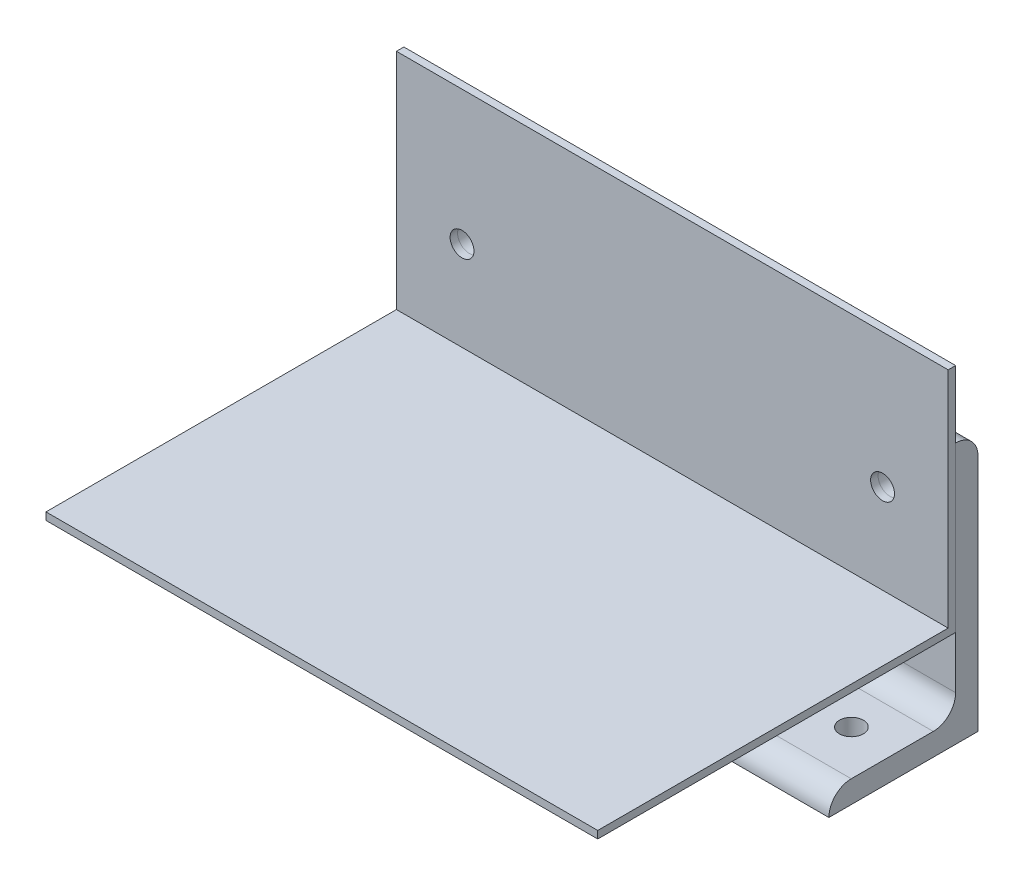
ISO-10303-21;
HEADER;
FILE_DESCRIPTION(('STEP AP214'),'2;1');
FILE_NAME('part.step','',(''),(''),'','','');
FILE_SCHEMA(('AUTOMOTIVE_DESIGN { 1 0 10303 214 1 1 1 1 }'));
ENDSEC;
DATA;
#1=APPLICATION_CONTEXT('core data for automotive mechanical design processes');
#2=APPLICATION_PROTOCOL_DEFINITION('international standard','automotive_design',2000,#1);
#3=PRODUCT_CONTEXT('',#1,'mechanical');
#4=PRODUCT('Part','Part','',(#3));
#5=PRODUCT_RELATED_PRODUCT_CATEGORY('part','',(#4));
#6=PRODUCT_DEFINITION_FORMATION('','',#4);
#7=PRODUCT_DEFINITION_CONTEXT('part definition',#1,'design');
#8=PRODUCT_DEFINITION('design','',#6,#7);
#9=PRODUCT_DEFINITION_SHAPE('','',#8);
#10=(LENGTH_UNIT() NAMED_UNIT(*) SI_UNIT(.MILLI.,.METRE.));
#11=(NAMED_UNIT(*) PLANE_ANGLE_UNIT() SI_UNIT($,.RADIAN.));
#12=(NAMED_UNIT(*) SI_UNIT($,.STERADIAN.) SOLID_ANGLE_UNIT());
#13=UNCERTAINTY_MEASURE_WITH_UNIT(LENGTH_MEASURE(1.E-05),#10,'distance_accuracy_value','');
#14=(GEOMETRIC_REPRESENTATION_CONTEXT(3) GLOBAL_UNCERTAINTY_ASSIGNED_CONTEXT((#13)) GLOBAL_UNIT_ASSIGNED_CONTEXT((#10,
#11,#12)) REPRESENTATION_CONTEXT('',''));
#15=CARTESIAN_POINT('',(0.,0.,0.));
#16=DIRECTION('',(0.,0.,1.));
#17=DIRECTION('',(1.,0.,0.));
#18=AXIS2_PLACEMENT_3D('',#15,#16,#17);
#19=CARTESIAN_POINT('',(74.,22.,-3.));
#20=DIRECTION('',(-1.,0.,0.));
#21=DIRECTION('',(0.,0.,1.));
#22=AXIS2_PLACEMENT_3D('',#19,#20,#21);
#23=PLANE('',#22);
#24=DIRECTION('',(0.,-1.,0.));
#25=VECTOR('',#24,1.);
#26=CARTESIAN_POINT('',(74.,22.,0.));
#27=LINE('',#26,#25);
#28=CARTESIAN_POINT('',(74.,22.,0.));
#29=VERTEX_POINT('',#28);
#30=CARTESIAN_POINT('',(74.,-7.,0.));
#31=VERTEX_POINT('',#30);
#32=EDGE_CURVE('E149',#29,#31,#27,.T.);
#33=ORIENTED_EDGE('',*,*,#32,.T.);
#34=CARTESIAN_POINT('',(74.,-7.,3.));
#35=DIRECTION('',(-1.,0.,0.));
#36=DIRECTION('',(0.,0.,1.));
#37=AXIS2_PLACEMENT_3D('',#34,#35,#36);
#38=CIRCLE('',#37,3.);
#39=CARTESIAN_POINT('',(74.,-10.,3.));
#40=VERTEX_POINT('',#39);
#41=EDGE_CURVE('E12',#31,#40,#38,.T.);
#42=ORIENTED_EDGE('',*,*,#41,.T.);
#43=DIRECTION('',(0.,0.,1.));
#44=VECTOR('',#43,1.);
#45=CARTESIAN_POINT('',(74.,-10.,-3.));
#46=LINE('',#45,#44);
#47=CARTESIAN_POINT('',(74.,-10.,14.));
#48=VERTEX_POINT('',#47);
#49=EDGE_CURVE('E139',#40,#48,#46,.T.);
#50=ORIENTED_EDGE('',*,*,#49,.T.);
#51=CARTESIAN_POINT('',(74.,-13.,14.));
#52=DIRECTION('',(-1.,0.,0.));
#53=DIRECTION('',(0.,0.,1.));
#54=AXIS2_PLACEMENT_3D('',#51,#52,#53);
#55=CIRCLE('',#54,3.);
#56=CARTESIAN_POINT('',(74.,-13.,17.));
#57=VERTEX_POINT('',#56);
#58=EDGE_CURVE('E168',#48,#57,#55,.F.);
#59=ORIENTED_EDGE('',*,*,#58,.T.);
#60=DIRECTION('',(0.,0.,1.));
#61=VECTOR('',#60,1.);
#62=CARTESIAN_POINT('',(74.,-13.,-3.));
#63=LINE('',#62,#61);
#64=CARTESIAN_POINT('',(74.,-13.,-3.));
#65=VERTEX_POINT('',#64);
#66=EDGE_CURVE('E132',#65,#57,#63,.T.);
#67=ORIENTED_EDGE('',*,*,#66,.F.);
#68=DIRECTION('',(0.,-1.,0.));
#69=VECTOR('',#68,1.);
#70=CARTESIAN_POINT('',(74.,22.,-3.));
#71=LINE('',#70,#69);
#72=CARTESIAN_POINT('',(74.,19.,-3.));
#73=VERTEX_POINT('',#72);
#74=EDGE_CURVE('E123',#73,#65,#71,.T.);
#75=ORIENTED_EDGE('',*,*,#74,.F.);
#76=CARTESIAN_POINT('',(74.,19.,0.));
#77=DIRECTION('',(-1.,0.,0.));
#78=DIRECTION('',(0.,0.,1.));
#79=AXIS2_PLACEMENT_3D('',#76,#77,#78);
#80=CIRCLE('',#79,3.);
#81=EDGE_CURVE('E160',#73,#29,#80,.F.);
#82=ORIENTED_EDGE('',*,*,#81,.T.);
#83=EDGE_LOOP('',(#33,#42,#50,#59,#67,#75,#82));
#84=FACE_BOUND('',#83,.T.);
#85=ADVANCED_FACE('F55',(#84),#23,.F.);
#86=CARTESIAN_POINT('',(0.,22.,-3.));
#87=DIRECTION('',(1.,0.,0.));
#88=DIRECTION('',(0.,0.,-1.));
#89=AXIS2_PLACEMENT_3D('',#86,#87,#88);
#90=PLANE('',#89);
#91=DIRECTION('',(0.,0.,-1.));
#92=VECTOR('',#91,1.);
#93=CARTESIAN_POINT('',(0.,-13.,-3.));
#94=LINE('',#93,#92);
#95=CARTESIAN_POINT('',(0.,-13.,17.));
#96=VERTEX_POINT('',#95);
#97=CARTESIAN_POINT('',(0.,-13.,-3.));
#98=VERTEX_POINT('',#97);
#99=EDGE_CURVE('E116',#96,#98,#94,.T.);
#100=ORIENTED_EDGE('',*,*,#99,.F.);
#101=CARTESIAN_POINT('',(0.,-13.,14.));
#102=DIRECTION('',(1.,0.,0.));
#103=DIRECTION('',(0.,0.,-1.));
#104=AXIS2_PLACEMENT_3D('',#101,#102,#103);
#105=CIRCLE('',#104,3.);
#106=CARTESIAN_POINT('',(0.,-10.,14.));
#107=VERTEX_POINT('',#106);
#108=EDGE_CURVE('E163',#96,#107,#105,.F.);
#109=ORIENTED_EDGE('',*,*,#108,.T.);
#110=DIRECTION('',(0.,0.,-1.));
#111=VECTOR('',#110,1.);
#112=CARTESIAN_POINT('',(0.,-10.,-3.));
#113=LINE('',#112,#111);
#114=CARTESIAN_POINT('',(0.,-10.,3.));
#115=VERTEX_POINT('',#114);
#116=EDGE_CURVE('E141',#107,#115,#113,.T.);
#117=ORIENTED_EDGE('',*,*,#116,.T.);
#118=CARTESIAN_POINT('',(0.,-7.,3.));
#119=DIRECTION('',(1.,0.,0.));
#120=DIRECTION('',(0.,0.,-1.));
#121=AXIS2_PLACEMENT_3D('',#118,#119,#120);
#122=CIRCLE('',#121,3.);
#123=CARTESIAN_POINT('',(0.,-7.,0.));
#124=VERTEX_POINT('',#123);
#125=EDGE_CURVE('E63',#115,#124,#122,.T.);
#126=ORIENTED_EDGE('',*,*,#125,.T.);
#127=DIRECTION('',(0.,1.,0.));
#128=VECTOR('',#127,1.);
#129=CARTESIAN_POINT('',(0.,22.,0.));
#130=LINE('',#129,#128);
#131=CARTESIAN_POINT('',(0.,22.,0.));
#132=VERTEX_POINT('',#131);
#133=EDGE_CURVE('E155',#124,#132,#130,.T.);
#134=ORIENTED_EDGE('',*,*,#133,.T.);
#135=CARTESIAN_POINT('',(0.,19.,0.));
#136=DIRECTION('',(1.,0.,0.));
#137=DIRECTION('',(0.,0.,-1.));
#138=AXIS2_PLACEMENT_3D('',#135,#136,#137);
#139=CIRCLE('',#138,3.);
#140=CARTESIAN_POINT('',(0.,19.,-3.));
#141=VERTEX_POINT('',#140);
#142=EDGE_CURVE('E118',#132,#141,#139,.F.);
#143=ORIENTED_EDGE('',*,*,#142,.T.);
#144=DIRECTION('',(0.,1.,0.));
#145=VECTOR('',#144,1.);
#146=CARTESIAN_POINT('',(0.,22.,-3.));
#147=LINE('',#146,#145);
#148=EDGE_CURVE('E112',#98,#141,#147,.T.);
#149=ORIENTED_EDGE('',*,*,#148,.F.);
#150=EDGE_LOOP('',(#100,#109,#117,#126,#134,#143,#149));
#151=FACE_BOUND('',#150,.T.);
#152=ADVANCED_FACE('F114',(#151),#90,.F.);
#153=CARTESIAN_POINT('',(0.,0.,-3.));
#154=DIRECTION('',(0.,0.,-1.));
#155=DIRECTION('',(-1.,0.,0.));
#156=AXIS2_PLACEMENT_3D('',#153,#154,#155);
#157=PLANE('',#156);
#158=CARTESIAN_POINT('',(65.2,13.,-3.));
#159=DIRECTION('',(0.,0.,-1.));
#160=DIRECTION('',(-1.,0.,0.));
#161=AXIS2_PLACEMENT_3D('',#158,#159,#160);
#162=CIRCLE('',#161,1.6);
#163=CARTESIAN_POINT('',(63.6,13.,-3.));
#164=VERTEX_POINT('',#163);
#165=EDGE_CURVE('E245',#164,#164,#162,.T.);
#166=ORIENTED_EDGE('',*,*,#165,.F.);
#167=EDGE_LOOP('',(#166));
#168=FACE_BOUND('',#167,.T.);
#169=CARTESIAN_POINT('',(8.8,13.,-3.));
#170=DIRECTION('',(0.,0.,-1.));
#171=DIRECTION('',(-1.,0.,0.));
#172=AXIS2_PLACEMENT_3D('',#169,#170,#171);
#173=CIRCLE('',#172,1.6);
#174=CARTESIAN_POINT('',(7.2,13.,-3.));
#175=VERTEX_POINT('',#174);
#176=EDGE_CURVE('E243',#175,#175,#173,.T.);
#177=ORIENTED_EDGE('',*,*,#176,.F.);
#178=EDGE_LOOP('',(#177));
#179=FACE_BOUND('',#178,.T.);
#180=ORIENTED_EDGE('',*,*,#148,.T.);
#181=DIRECTION('',(1.,0.,0.));
#182=VECTOR('',#181,1.);
#183=CARTESIAN_POINT('',(74.,19.,-3.));
#184=LINE('',#183,#182);
#185=EDGE_CURVE('E122',#141,#73,#184,.T.);
#186=ORIENTED_EDGE('',*,*,#185,.T.);
#187=ORIENTED_EDGE('',*,*,#74,.T.);
#188=DIRECTION('',(1.,0.,0.));
#189=VECTOR('',#188,1.);
#190=CARTESIAN_POINT('',(0.,-13.,-3.));
#191=LINE('',#190,#189);
#192=EDGE_CURVE('E126',#98,#65,#191,.T.);
#193=ORIENTED_EDGE('',*,*,#192,.F.);
#194=EDGE_LOOP('',(#180,#186,#187,#193));
#195=FACE_BOUND('',#194,.T.);
#196=ADVANCED_FACE('F127',(#168,#179,#195),#157,.T.);
#197=CARTESIAN_POINT('',(0.,0.,0.));
#198=DIRECTION('',(0.,0.,-1.));
#199=DIRECTION('',(-1.,0.,0.));
#200=AXIS2_PLACEMENT_3D('',#197,#198,#199);
#201=PLANE('',#200);
#202=CARTESIAN_POINT('',(65.2,13.,0.));
#203=DIRECTION('',(0.,0.,-1.));
#204=DIRECTION('',(-1.,0.,0.));
#205=AXIS2_PLACEMENT_3D('',#202,#203,#204);
#206=CIRCLE('',#205,1.6);
#207=CARTESIAN_POINT('',(63.6,13.,0.));
#208=VERTEX_POINT('',#207);
#209=EDGE_CURVE('E248',#208,#208,#206,.T.);
#210=ORIENTED_EDGE('',*,*,#209,.T.);
#211=EDGE_LOOP('',(#210));
#212=FACE_BOUND('',#211,.T.);
#213=CARTESIAN_POINT('',(8.8,13.,0.));
#214=DIRECTION('',(0.,0.,-1.));
#215=DIRECTION('',(-1.,0.,0.));
#216=AXIS2_PLACEMENT_3D('',#213,#214,#215);
#217=CIRCLE('',#216,1.6);
#218=CARTESIAN_POINT('',(7.2,13.,0.));
#219=VERTEX_POINT('',#218);
#220=EDGE_CURVE('E240',#219,#219,#217,.T.);
#221=ORIENTED_EDGE('',*,*,#220,.T.);
#222=EDGE_LOOP('',(#221));
#223=FACE_BOUND('',#222,.T.);
#224=ORIENTED_EDGE('',*,*,#133,.F.);
#225=DIRECTION('',(-1.,0.,0.));
#226=VECTOR('',#225,1.);
#227=CARTESIAN_POINT('',(0.,-7.,0.));
#228=LINE('',#227,#226);
#229=EDGE_CURVE('E76',#124,#31,#228,.F.);
#230=ORIENTED_EDGE('',*,*,#229,.T.);
#231=ORIENTED_EDGE('',*,*,#32,.F.);
#232=DIRECTION('',(1.,0.,0.));
#233=VECTOR('',#232,1.);
#234=CARTESIAN_POINT('',(74.,22.,0.));
#235=LINE('',#234,#233);
#236=EDGE_CURVE('E152',#132,#29,#235,.T.);
#237=ORIENTED_EDGE('',*,*,#236,.F.);
#238=EDGE_LOOP('',(#224,#230,#231,#237));
#239=FACE_BOUND('',#238,.T.);
#240=ADVANCED_FACE('F212',(#212,#223,#239),#201,.F.);
#241=CARTESIAN_POINT('',(0.,-13.,0.));
#242=DIRECTION('',(0.,1.,0.));
#243=DIRECTION('',(-1.,0.,0.));
#244=AXIS2_PLACEMENT_3D('',#241,#242,#243);
#245=PLANE('',#244);
#246=ORIENTED_EDGE('',*,*,#99,.T.);
#247=ORIENTED_EDGE('',*,*,#192,.T.);
#248=ORIENTED_EDGE('',*,*,#66,.T.);
#249=DIRECTION('',(-1.,0.,0.));
#250=VECTOR('',#249,1.);
#251=CARTESIAN_POINT('',(0.,-13.,17.));
#252=LINE('',#251,#250);
#253=EDGE_CURVE('E138',#57,#96,#252,.T.);
#254=ORIENTED_EDGE('',*,*,#253,.T.);
#255=EDGE_LOOP('',(#246,#247,#248,#254));
#256=FACE_BOUND('',#255,.T.);
#257=CARTESIAN_POINT('',(6.,-13.,7.97970915721891));
#258=DIRECTION('',(0.,-1.,0.));
#259=DIRECTION('',(1.,0.,0.));
#260=AXIS2_PLACEMENT_3D('',#257,#258,#259);
#261=CIRCLE('',#260,1.6);
#262=CARTESIAN_POINT('',(7.6,-13.,7.97970915721891));
#263=VERTEX_POINT('',#262);
#264=EDGE_CURVE('E150',#263,#263,#261,.T.);
#265=ORIENTED_EDGE('',*,*,#264,.F.);
#266=EDGE_LOOP('',(#265));
#267=FACE_BOUND('',#266,.T.);
#268=CARTESIAN_POINT('',(68.,-13.,7.97970915721891));
#269=DIRECTION('',(0.,-1.,0.));
#270=DIRECTION('',(1.,0.,0.));
#271=AXIS2_PLACEMENT_3D('',#268,#269,#270);
#272=CIRCLE('',#271,1.6);
#273=CARTESIAN_POINT('',(69.6,-13.,7.97970915721891));
#274=VERTEX_POINT('',#273);
#275=EDGE_CURVE('E253',#274,#274,#272,.T.);
#276=ORIENTED_EDGE('',*,*,#275,.F.);
#277=EDGE_LOOP('',(#276));
#278=FACE_BOUND('',#277,.T.);
#279=ADVANCED_FACE('F135',(#256,#267,#278),#245,.F.);
#280=CARTESIAN_POINT('',(0.,-10.,0.));
#281=DIRECTION('',(0.,1.,0.));
#282=DIRECTION('',(-1.,0.,0.));
#283=AXIS2_PLACEMENT_3D('',#280,#281,#282);
#284=PLANE('',#283);
#285=CARTESIAN_POINT('',(6.,-10.,7.97970915721891));
#286=DIRECTION('',(0.,-1.,0.));
#287=DIRECTION('',(1.,0.,0.));
#288=AXIS2_PLACEMENT_3D('',#285,#286,#287);
#289=CIRCLE('',#288,1.6);
#290=CARTESIAN_POINT('',(7.6,-10.,7.97970915721891));
#291=VERTEX_POINT('',#290);
#292=EDGE_CURVE('E144',#291,#291,#289,.T.);
#293=ORIENTED_EDGE('',*,*,#292,.T.);
#294=EDGE_LOOP('',(#293));
#295=FACE_BOUND('',#294,.T.);
#296=ORIENTED_EDGE('',*,*,#49,.F.);
#297=DIRECTION('',(-1.,0.,0.));
#298=VECTOR('',#297,1.);
#299=CARTESIAN_POINT('',(0.,-10.,3.));
#300=LINE('',#299,#298);
#301=EDGE_CURVE('E170',#40,#115,#300,.T.);
#302=ORIENTED_EDGE('',*,*,#301,.T.);
#303=ORIENTED_EDGE('',*,*,#116,.F.);
#304=DIRECTION('',(-1.,0.,0.));
#305=VECTOR('',#304,1.);
#306=CARTESIAN_POINT('',(74.,-10.,14.));
#307=LINE('',#306,#305);
#308=EDGE_CURVE('E165',#107,#48,#307,.F.);
#309=ORIENTED_EDGE('',*,*,#308,.T.);
#310=EDGE_LOOP('',(#296,#302,#303,#309));
#311=FACE_BOUND('',#310,.T.);
#312=CARTESIAN_POINT('',(68.,-10.,7.97970915721891));
#313=DIRECTION('',(0.,-1.,0.));
#314=DIRECTION('',(1.,0.,0.));
#315=AXIS2_PLACEMENT_3D('',#312,#313,#314);
#316=CIRCLE('',#315,1.6);
#317=CARTESIAN_POINT('',(69.6,-10.,7.97970915721891));
#318=VERTEX_POINT('',#317);
#319=EDGE_CURVE('E256',#318,#318,#316,.T.);
#320=ORIENTED_EDGE('',*,*,#319,.T.);
#321=EDGE_LOOP('',(#320));
#322=FACE_BOUND('',#321,.T.);
#323=ADVANCED_FACE('F177',(#295,#311,#322),#284,.T.);
#324=CARTESIAN_POINT('',(6.,-13.,7.97970915721891));
#325=DIRECTION('',(0.,1.,0.));
#326=DIRECTION('',(-1.,0.,0.));
#327=AXIS2_PLACEMENT_3D('',#324,#325,#326);
#328=CYLINDRICAL_SURFACE('',#327,1.6);
#329=ORIENTED_EDGE('',*,*,#264,.T.);
#330=EDGE_LOOP('',(#329));
#331=FACE_BOUND('',#330,.T.);
#332=ORIENTED_EDGE('',*,*,#292,.F.);
#333=EDGE_LOOP('',(#332));
#334=FACE_BOUND('',#333,.T.);
#335=ADVANCED_FACE('F223',(#331,#334),#328,.F.);
#336=CARTESIAN_POINT('',(68.,-13.,7.97970915721891));
#337=DIRECTION('',(0.,1.,0.));
#338=DIRECTION('',(-1.,0.,0.));
#339=AXIS2_PLACEMENT_3D('',#336,#337,#338);
#340=CYLINDRICAL_SURFACE('',#339,1.6);
#341=ORIENTED_EDGE('',*,*,#275,.T.);
#342=EDGE_LOOP('',(#341));
#343=FACE_BOUND('',#342,.T.);
#344=ORIENTED_EDGE('',*,*,#319,.F.);
#345=EDGE_LOOP('',(#344));
#346=FACE_BOUND('',#345,.T.);
#347=ADVANCED_FACE('F228',(#343,#346),#340,.F.);
#348=CARTESIAN_POINT('',(8.8,13.,0.));
#349=DIRECTION('',(0.,0.,-1.));
#350=DIRECTION('',(-1.,0.,0.));
#351=AXIS2_PLACEMENT_3D('',#348,#349,#350);
#352=CYLINDRICAL_SURFACE('',#351,1.6);
#353=ORIENTED_EDGE('',*,*,#220,.F.);
#354=EDGE_LOOP('',(#353));
#355=FACE_BOUND('',#354,.T.);
#356=ORIENTED_EDGE('',*,*,#176,.T.);
#357=EDGE_LOOP('',(#356));
#358=FACE_BOUND('',#357,.T.);
#359=ADVANCED_FACE('F208',(#355,#358),#352,.F.);
#360=CARTESIAN_POINT('',(65.2,13.,0.));
#361=DIRECTION('',(0.,0.,-1.));
#362=DIRECTION('',(-1.,0.,0.));
#363=AXIS2_PLACEMENT_3D('',#360,#361,#362);
#364=CYLINDRICAL_SURFACE('',#363,1.6);
#365=ORIENTED_EDGE('',*,*,#209,.F.);
#366=EDGE_LOOP('',(#365));
#367=FACE_BOUND('',#366,.T.);
#368=ORIENTED_EDGE('',*,*,#165,.T.);
#369=EDGE_LOOP('',(#368));
#370=FACE_BOUND('',#369,.T.);
#371=ADVANCED_FACE('F201',(#367,#370),#364,.F.);
#372=CARTESIAN_POINT('',(0.,19.,0.));
#373=DIRECTION('',(-1.,0.,0.));
#374=DIRECTION('',(0.,0.,1.));
#375=AXIS2_PLACEMENT_3D('',#372,#373,#374);
#376=CYLINDRICAL_SURFACE('',#375,3.);
#377=ORIENTED_EDGE('',*,*,#142,.F.);
#378=ORIENTED_EDGE('',*,*,#236,.T.);
#379=ORIENTED_EDGE('',*,*,#81,.F.);
#380=ORIENTED_EDGE('',*,*,#185,.F.);
#381=EDGE_LOOP('',(#377,#378,#379,#380));
#382=FACE_BOUND('',#381,.T.);
#383=ADVANCED_FACE('F191',(#382),#376,.T.);
#384=CARTESIAN_POINT('',(0.,-13.,14.));
#385=DIRECTION('',(1.,0.,0.));
#386=DIRECTION('',(0.,1.,0.));
#387=AXIS2_PLACEMENT_3D('',#384,#385,#386);
#388=CYLINDRICAL_SURFACE('',#387,3.);
#389=ORIENTED_EDGE('',*,*,#58,.F.);
#390=ORIENTED_EDGE('',*,*,#308,.F.);
#391=ORIENTED_EDGE('',*,*,#108,.F.);
#392=ORIENTED_EDGE('',*,*,#253,.F.);
#393=EDGE_LOOP('',(#389,#390,#391,#392));
#394=FACE_BOUND('',#393,.T.);
#395=ADVANCED_FACE('F184',(#394),#388,.T.);
#396=CARTESIAN_POINT('',(0.,-7.,3.));
#397=DIRECTION('',(-1.,0.,0.));
#398=DIRECTION('',(0.,-1.,0.));
#399=AXIS2_PLACEMENT_3D('',#396,#397,#398);
#400=CYLINDRICAL_SURFACE('',#399,3.);
#401=ORIENTED_EDGE('',*,*,#41,.F.);
#402=ORIENTED_EDGE('',*,*,#229,.F.);
#403=ORIENTED_EDGE('',*,*,#125,.F.);
#404=ORIENTED_EDGE('',*,*,#301,.F.);
#405=EDGE_LOOP('',(#401,#402,#403,#404));
#406=FACE_BOUND('',#405,.T.);
#407=ADVANCED_FACE('F57',(#406),#400,.F.);
#408=CLOSED_SHELL('',(#85,#152,#196,#240,#279,#323,#335,#347,#359,#371,#383,#395,#407));
#409=MANIFOLD_SOLID_BREP('B2',#408);
#410=CARTESIAN_POINT('',(74.,0.,0.));
#411=DIRECTION('',(0.,0.,1.));
#412=DIRECTION('',(1.,0.,0.));
#413=AXIS2_PLACEMENT_3D('',#410,#411,#412);
#414=PLANE('',#413);
#415=CARTESIAN_POINT('',(65.2,13.,0.));
#416=DIRECTION('',(0.,0.,-1.));
#417=DIRECTION('',(-1.,0.,0.));
#418=AXIS2_PLACEMENT_3D('',#415,#416,#417);
#419=CIRCLE('',#418,1.6);
#420=CARTESIAN_POINT('',(63.6,13.,0.));
#421=VERTEX_POINT('',#420);
#422=EDGE_CURVE('E453',#421,#421,#419,.T.);
#423=ORIENTED_EDGE('',*,*,#422,.F.);
#424=EDGE_LOOP('',(#423));
#425=FACE_BOUND('',#424,.T.);
#426=CARTESIAN_POINT('',(8.8,13.,0.));
#427=DIRECTION('',(0.,0.,-1.));
#428=DIRECTION('',(-1.,0.,0.));
#429=AXIS2_PLACEMENT_3D('',#426,#427,#428);
#430=CIRCLE('',#429,1.6);
#431=CARTESIAN_POINT('',(7.2,13.,0.));
#432=VERTEX_POINT('',#431);
#433=EDGE_CURVE('E458',#432,#432,#430,.T.);
#434=ORIENTED_EDGE('',*,*,#433,.F.);
#435=EDGE_LOOP('',(#434));
#436=FACE_BOUND('',#435,.T.);
#437=DIRECTION('',(0.,1.,0.));
#438=VECTOR('',#437,1.);
#439=CARTESIAN_POINT('',(0.,0.,0.));
#440=LINE('',#439,#438);
#441=CARTESIAN_POINT('',(0.,0.,0.));
#442=VERTEX_POINT('',#441);
#443=CARTESIAN_POINT('',(0.,31.,0.));
#444=VERTEX_POINT('',#443);
#445=EDGE_CURVE('E436',#442,#444,#440,.T.);
#446=ORIENTED_EDGE('',*,*,#445,.T.);
#447=DIRECTION('',(-1.,0.,0.));
#448=VECTOR('',#447,1.);
#449=CARTESIAN_POINT('',(74.,31.,0.));
#450=LINE('',#449,#448);
#451=CARTESIAN_POINT('',(74.,31.,0.));
#452=VERTEX_POINT('',#451);
#453=EDGE_CURVE('E53',#452,#444,#450,.T.);
#454=ORIENTED_EDGE('',*,*,#453,.F.);
#455=DIRECTION('',(0.,1.,0.));
#456=VECTOR('',#455,1.);
#457=CARTESIAN_POINT('',(74.,0.,0.));
#458=LINE('',#457,#456);
#459=CARTESIAN_POINT('',(74.,0.,0.));
#460=VERTEX_POINT('',#459);
#461=EDGE_CURVE('E446',#460,#452,#458,.T.);
#462=ORIENTED_EDGE('',*,*,#461,.F.);
#463=DIRECTION('',(-1.,0.,0.));
#464=VECTOR('',#463,1.);
#465=CARTESIAN_POINT('',(74.,0.,0.));
#466=LINE('',#465,#464);
#467=EDGE_CURVE('E432',#460,#442,#466,.T.);
#468=ORIENTED_EDGE('',*,*,#467,.T.);
#469=EDGE_LOOP('',(#446,#454,#462,#468));
#470=FACE_BOUND('',#469,.T.);
#471=ADVANCED_FACE('F350',(#425,#436,#470),#414,.F.);
#472=CARTESIAN_POINT('',(74.,31.,0.));
#473=DIRECTION('',(0.,-1.,0.));
#474=DIRECTION('',(0.,0.,-1.));
#475=AXIS2_PLACEMENT_3D('',#472,#473,#474);
#476=PLANE('',#475);
#477=DIRECTION('',(0.,0.,1.));
#478=VECTOR('',#477,1.);
#479=CARTESIAN_POINT('',(0.,31.,0.));
#480=LINE('',#479,#478);
#481=CARTESIAN_POINT('',(0.,31.,1.));
#482=VERTEX_POINT('',#481);
#483=EDGE_CURVE('E439',#444,#482,#480,.T.);
#484=ORIENTED_EDGE('',*,*,#483,.T.);
#485=DIRECTION('',(-1.,0.,0.));
#486=VECTOR('',#485,1.);
#487=CARTESIAN_POINT('',(74.,31.,1.));
#488=LINE('',#487,#486);
#489=CARTESIAN_POINT('',(74.,31.,1.));
#490=VERTEX_POINT('',#489);
#491=EDGE_CURVE('E359',#490,#482,#488,.T.);
#492=ORIENTED_EDGE('',*,*,#491,.F.);
#493=DIRECTION('',(0.,0.,1.));
#494=VECTOR('',#493,1.);
#495=CARTESIAN_POINT('',(74.,31.,0.));
#496=LINE('',#495,#494);
#497=EDGE_CURVE('E405',#452,#490,#496,.T.);
#498=ORIENTED_EDGE('',*,*,#497,.F.);
#499=ORIENTED_EDGE('',*,*,#453,.T.);
#500=EDGE_LOOP('',(#484,#492,#498,#499));
#501=FACE_BOUND('',#500,.T.);
#502=ADVANCED_FACE('F468',(#501),#476,.F.);
#503=CARTESIAN_POINT('',(74.,31.,1.));
#504=DIRECTION('',(0.,0.,-1.));
#505=DIRECTION('',(0.,1.,0.));
#506=AXIS2_PLACEMENT_3D('',#503,#504,#505);
#507=PLANE('',#506);
#508=CARTESIAN_POINT('',(65.2,13.,0.999999999999996));
#509=DIRECTION('',(0.,0.,-1.));
#510=DIRECTION('',(0.,1.,0.));
#511=AXIS2_PLACEMENT_3D('',#508,#509,#510);
#512=CIRCLE('',#511,1.6);
#513=CARTESIAN_POINT('',(63.6,13.,0.999999999999997));
#514=VERTEX_POINT('',#513);
#515=EDGE_CURVE('E353',#514,#514,#512,.T.);
#516=ORIENTED_EDGE('',*,*,#515,.T.);
#517=EDGE_LOOP('',(#516));
#518=FACE_BOUND('',#517,.T.);
#519=CARTESIAN_POINT('',(8.8,13.,0.999999999999996));
#520=DIRECTION('',(0.,0.,-1.));
#521=DIRECTION('',(0.,1.,0.));
#522=AXIS2_PLACEMENT_3D('',#519,#520,#521);
#523=CIRCLE('',#522,1.6);
#524=CARTESIAN_POINT('',(7.2,13.,0.999999999999997));
#525=VERTEX_POINT('',#524);
#526=EDGE_CURVE('E451',#525,#525,#523,.T.);
#527=ORIENTED_EDGE('',*,*,#526,.T.);
#528=EDGE_LOOP('',(#527));
#529=FACE_BOUND('',#528,.T.);
#530=DIRECTION('',(0.,-1.,0.));
#531=VECTOR('',#530,1.);
#532=CARTESIAN_POINT('',(0.,31.,1.));
#533=LINE('',#532,#531);
#534=CARTESIAN_POINT('',(0.,0.999999999999994,0.999999999999994));
#535=VERTEX_POINT('',#534);
#536=EDGE_CURVE('E441',#482,#535,#533,.T.);
#537=ORIENTED_EDGE('',*,*,#536,.T.);
#538=DIRECTION('',(-1.,0.,0.));
#539=VECTOR('',#538,1.);
#540=CARTESIAN_POINT('',(74.,0.999999999999994,0.999999999999994));
#541=LINE('',#540,#539);
#542=CARTESIAN_POINT('',(74.,0.999999999999994,0.999999999999994));
#543=VERTEX_POINT('',#542);
#544=EDGE_CURVE('E427',#543,#535,#541,.T.);
#545=ORIENTED_EDGE('',*,*,#544,.F.);
#546=DIRECTION('',(0.,-1.,0.));
#547=VECTOR('',#546,1.);
#548=CARTESIAN_POINT('',(74.,31.,1.));
#549=LINE('',#548,#547);
#550=EDGE_CURVE('E418',#490,#543,#549,.T.);
#551=ORIENTED_EDGE('',*,*,#550,.F.);
#552=ORIENTED_EDGE('',*,*,#491,.T.);
#553=EDGE_LOOP('',(#537,#545,#551,#552));
#554=FACE_BOUND('',#553,.T.);
#555=ADVANCED_FACE('F471',(#518,#529,#554),#507,.F.);
#556=CARTESIAN_POINT('',(74.,0.999999999999994,48.));
#557=DIRECTION('',(0.,-1.,0.));
#558=DIRECTION('',(0.,0.,-1.));
#559=AXIS2_PLACEMENT_3D('',#556,#557,#558);
#560=PLANE('',#559);
#561=DIRECTION('',(0.,0.,1.));
#562=VECTOR('',#561,1.);
#563=CARTESIAN_POINT('',(0.,0.999999999999994,48.));
#564=LINE('',#563,#562);
#565=CARTESIAN_POINT('',(0.,0.999999999999994,48.));
#566=VERTEX_POINT('',#565);
#567=EDGE_CURVE('E426',#535,#566,#564,.T.);
#568=ORIENTED_EDGE('',*,*,#567,.T.);
#569=DIRECTION('',(-1.,0.,0.));
#570=VECTOR('',#569,1.);
#571=CARTESIAN_POINT('',(74.,0.999999999999994,48.));
#572=LINE('',#571,#570);
#573=CARTESIAN_POINT('',(74.,0.999999999999994,48.));
#574=VERTEX_POINT('',#573);
#575=EDGE_CURVE('E423',#574,#566,#572,.T.);
#576=ORIENTED_EDGE('',*,*,#575,.F.);
#577=DIRECTION('',(0.,0.,1.));
#578=VECTOR('',#577,1.);
#579=CARTESIAN_POINT('',(74.,0.999999999999994,48.));
#580=LINE('',#579,#578);
#581=EDGE_CURVE('E412',#543,#574,#580,.T.);
#582=ORIENTED_EDGE('',*,*,#581,.F.);
#583=ORIENTED_EDGE('',*,*,#544,.T.);
#584=EDGE_LOOP('',(#568,#576,#582,#583));
#585=FACE_BOUND('',#584,.T.);
#586=ADVANCED_FACE('F424',(#585),#560,.F.);
#587=CARTESIAN_POINT('',(74.,0.,48.));
#588=DIRECTION('',(0.,0.,-1.));
#589=DIRECTION('',(0.,1.,0.));
#590=AXIS2_PLACEMENT_3D('',#587,#588,#589);
#591=PLANE('',#590);
#592=DIRECTION('',(0.,-1.,0.));
#593=VECTOR('',#592,1.);
#594=CARTESIAN_POINT('',(0.,0.,48.));
#595=LINE('',#594,#593);
#596=CARTESIAN_POINT('',(0.,0.,48.));
#597=VERTEX_POINT('',#596);
#598=EDGE_CURVE('E391',#566,#597,#595,.T.);
#599=ORIENTED_EDGE('',*,*,#598,.T.);
#600=DIRECTION('',(-1.,0.,0.));
#601=VECTOR('',#600,1.);
#602=CARTESIAN_POINT('',(74.,0.,48.));
#603=LINE('',#602,#601);
#604=CARTESIAN_POINT('',(74.,0.,48.));
#605=VERTEX_POINT('',#604);
#606=EDGE_CURVE('E428',#605,#597,#603,.T.);
#607=ORIENTED_EDGE('',*,*,#606,.F.);
#608=DIRECTION('',(0.,-1.,0.));
#609=VECTOR('',#608,1.);
#610=CARTESIAN_POINT('',(74.,0.,48.));
#611=LINE('',#610,#609);
#612=EDGE_CURVE('E416',#574,#605,#611,.T.);
#613=ORIENTED_EDGE('',*,*,#612,.F.);
#614=ORIENTED_EDGE('',*,*,#575,.T.);
#615=EDGE_LOOP('',(#599,#607,#613,#614));
#616=FACE_BOUND('',#615,.T.);
#617=ADVANCED_FACE('F430',(#616),#591,.F.);
#618=CARTESIAN_POINT('',(74.,0.,0.));
#619=DIRECTION('',(0.,1.,0.));
#620=DIRECTION('',(0.,0.,1.));
#621=AXIS2_PLACEMENT_3D('',#618,#619,#620);
#622=PLANE('',#621);
#623=DIRECTION('',(0.,0.,-1.));
#624=VECTOR('',#623,1.);
#625=CARTESIAN_POINT('',(0.,0.,0.));
#626=LINE('',#625,#624);
#627=EDGE_CURVE('E397',#597,#442,#626,.T.);
#628=ORIENTED_EDGE('',*,*,#627,.T.);
#629=ORIENTED_EDGE('',*,*,#467,.F.);
#630=DIRECTION('',(0.,0.,-1.));
#631=VECTOR('',#630,1.);
#632=CARTESIAN_POINT('',(74.,0.,0.));
#633=LINE('',#632,#631);
#634=EDGE_CURVE('E368',#605,#460,#633,.T.);
#635=ORIENTED_EDGE('',*,*,#634,.F.);
#636=ORIENTED_EDGE('',*,*,#606,.T.);
#637=EDGE_LOOP('',(#628,#629,#635,#636));
#638=FACE_BOUND('',#637,.T.);
#639=ADVANCED_FACE('F476',(#638),#622,.F.);
#640=CARTESIAN_POINT('',(74.,0.,0.));
#641=DIRECTION('',(1.,0.,0.));
#642=DIRECTION('',(0.,0.,-1.));
#643=AXIS2_PLACEMENT_3D('',#640,#641,#642);
#644=PLANE('',#643);
#645=ORIENTED_EDGE('',*,*,#461,.T.);
#646=ORIENTED_EDGE('',*,*,#497,.T.);
#647=ORIENTED_EDGE('',*,*,#550,.T.);
#648=ORIENTED_EDGE('',*,*,#581,.T.);
#649=ORIENTED_EDGE('',*,*,#612,.T.);
#650=ORIENTED_EDGE('',*,*,#634,.T.);
#651=EDGE_LOOP('',(#645,#646,#647,#648,#649,#650));
#652=FACE_BOUND('',#651,.T.);
#653=ADVANCED_FACE('F414',(#652),#644,.T.);
#654=CARTESIAN_POINT('',(0.,0.,0.));
#655=DIRECTION('',(1.,0.,0.));
#656=DIRECTION('',(0.,0.,-1.));
#657=AXIS2_PLACEMENT_3D('',#654,#655,#656);
#658=PLANE('',#657);
#659=ORIENTED_EDGE('',*,*,#445,.F.);
#660=ORIENTED_EDGE('',*,*,#627,.F.);
#661=ORIENTED_EDGE('',*,*,#598,.F.);
#662=ORIENTED_EDGE('',*,*,#567,.F.);
#663=ORIENTED_EDGE('',*,*,#536,.F.);
#664=ORIENTED_EDGE('',*,*,#483,.F.);
#665=EDGE_LOOP('',(#659,#660,#661,#662,#663,#664));
#666=FACE_BOUND('',#665,.T.);
#667=ADVANCED_FACE('F474',(#666),#658,.F.);
#668=CARTESIAN_POINT('',(8.8,13.,13.));
#669=DIRECTION('',(0.,0.,-1.));
#670=DIRECTION('',(-1.,0.,0.));
#671=AXIS2_PLACEMENT_3D('',#668,#669,#670);
#672=CYLINDRICAL_SURFACE('',#671,1.6);
#673=CARTESIAN_POINT('',(7.2,13.,0.));
#674=CARTESIAN_POINT('',(7.2,13.,0.0104166666666667));
#675=CARTESIAN_POINT('',(7.2,13.,0.0208333333333333));
#676=CARTESIAN_POINT('',(7.2,13.,0.0416666666666667));
#677=CARTESIAN_POINT('',(7.2,13.,0.0520833333333334));
#678=CARTESIAN_POINT('',(7.2,13.,0.0729166666666667));
#679=CARTESIAN_POINT('',(7.2,13.,0.0833333333333334));
#680=CARTESIAN_POINT('',(7.2,13.,0.104166666666667));
#681=CARTESIAN_POINT('',(7.2,13.,0.114583333333333));
#682=CARTESIAN_POINT('',(7.2,13.,0.135416666666667));
#683=CARTESIAN_POINT('',(7.2,13.,0.145833333333333));
#684=CARTESIAN_POINT('',(7.2,13.,0.166666666666667));
#685=CARTESIAN_POINT('',(7.2,13.,0.177083333333333));
#686=CARTESIAN_POINT('',(7.2,13.,0.197916666666667));
#687=CARTESIAN_POINT('',(7.2,13.,0.208333333333334));
#688=CARTESIAN_POINT('',(7.2,13.,0.229166666666667));
#689=CARTESIAN_POINT('',(7.2,13.,0.239583333333334));
#690=CARTESIAN_POINT('',(7.2,13.,0.260416666666666));
#691=CARTESIAN_POINT('',(7.2,13.,0.270833333333332));
#692=CARTESIAN_POINT('',(7.2,13.,0.291666666666665));
#693=CARTESIAN_POINT('',(7.2,13.,0.302083333333332));
#694=CARTESIAN_POINT('',(7.2,13.,0.322916666666665));
#695=CARTESIAN_POINT('',(7.2,13.,0.333333333333332));
#696=CARTESIAN_POINT('',(7.2,13.,0.354166666666665));
#697=CARTESIAN_POINT('',(7.2,13.,0.364583333333332));
#698=CARTESIAN_POINT('',(7.2,13.,0.385416666666665));
#699=CARTESIAN_POINT('',(7.2,13.,0.395833333333332));
#700=CARTESIAN_POINT('',(7.2,13.,0.416666666666665));
#701=CARTESIAN_POINT('',(7.2,13.,0.427083333333332));
#702=CARTESIAN_POINT('',(7.2,13.,0.447916666666665));
#703=CARTESIAN_POINT('',(7.2,13.,0.458333333333332));
#704=CARTESIAN_POINT('',(7.2,13.,0.479166666666665));
#705=CARTESIAN_POINT('',(7.2,13.,0.489583333333332));
#706=CARTESIAN_POINT('',(7.2,13.,0.510416666666665));
#707=CARTESIAN_POINT('',(7.2,13.,0.520833333333332));
#708=CARTESIAN_POINT('',(7.2,13.,0.541666666666665));
#709=CARTESIAN_POINT('',(7.2,13.,0.552083333333332));
#710=CARTESIAN_POINT('',(7.2,13.,0.572916666666666));
#711=CARTESIAN_POINT('',(7.2,13.,0.583333333333332));
#712=CARTESIAN_POINT('',(7.2,13.,0.604166666666666));
#713=CARTESIAN_POINT('',(7.2,13.,0.614583333333332));
#714=CARTESIAN_POINT('',(7.2,13.,0.635416666666666));
#715=CARTESIAN_POINT('',(7.2,13.,0.645833333333332));
#716=CARTESIAN_POINT('',(7.2,13.,0.666666666666666));
#717=CARTESIAN_POINT('',(7.2,13.,0.677083333333332));
#718=CARTESIAN_POINT('',(7.2,13.,0.697916666666666));
#719=CARTESIAN_POINT('',(7.2,13.,0.708333333333332));
#720=CARTESIAN_POINT('',(7.2,13.,0.729166666666665));
#721=CARTESIAN_POINT('',(7.2,13.,0.739583333333331));
#722=CARTESIAN_POINT('',(7.2,13.,0.760416666666664));
#723=CARTESIAN_POINT('',(7.2,13.,0.77083333333333));
#724=CARTESIAN_POINT('',(7.2,13.,0.791666666666664));
#725=CARTESIAN_POINT('',(7.2,13.,0.802083333333331));
#726=CARTESIAN_POINT('',(7.2,13.,0.822916666666664));
#727=CARTESIAN_POINT('',(7.2,13.,0.833333333333331));
#728=CARTESIAN_POINT('',(7.2,13.,0.854166666666664));
#729=CARTESIAN_POINT('',(7.2,13.,0.864583333333331));
#730=CARTESIAN_POINT('',(7.2,13.,0.885416666666664));
#731=CARTESIAN_POINT('',(7.2,13.,0.895833333333331));
#732=CARTESIAN_POINT('',(7.2,13.,0.916666666666664));
#733=CARTESIAN_POINT('',(7.2,13.,0.927083333333331));
#734=CARTESIAN_POINT('',(7.2,13.,0.947916666666664));
#735=CARTESIAN_POINT('',(7.2,13.,0.958333333333331));
#736=CARTESIAN_POINT('',(7.2,13.,0.979166666666664));
#737=CARTESIAN_POINT('',(7.2,13.,0.989583333333331));
#738=CARTESIAN_POINT('',(7.2,13.,0.999999999999997));
#739=B_SPLINE_CURVE_WITH_KNOTS('',3,(#673,#674,#675,#676,#677,#678,#679,#680,#681,#682,#683,
#684,#685,#686,#687,#688,#689,#690,#691,#692,#693,#694,#695,#696,#697,#698,#699,#700,#701,#702,
#703,#704,#705,#706,#707,#708,#709,#710,#711,#712,#713,#714,#715,#716,#717,#718,#719,#720,#721,
#722,#723,#724,#725,#726,#727,#728,#729,#730,#731,#732,#733,#734,#735,#736,#737,#738),
.UNSPECIFIED.,.F.,.F.,(4,2,2,2,2,2,2,2,2,2,2,2,2,2,2,2,2,2,2,2,2,2,2,2,2,2,2,2,2,2,2,2,4),(0.,
0.03125,0.0625000000000001,0.0937500000000001,0.125,0.15625,0.1875,0.21875,0.25,
0.281249999999999,0.312499999999999,0.343749999999999,0.374999999999999,0.406249999999999,
0.437499999999999,0.468749999999999,0.499999999999999,0.531249999999999,0.562499999999999,
0.593749999999999,0.624999999999999,0.656249999999999,0.687499999999999,0.718749999999999,
0.749999999999997,0.781249999999997,0.812499999999997,0.843749999999997,0.874999999999997,
0.906249999999997,0.937499999999997,0.968749999999997,0.999999999999997),.UNSPECIFIED.);
#740=EDGE_CURVE('BSEAM496',#432,#525,#739,.T.);
#741=ORIENTED_EDGE('',*,*,#433,.T.);
#742=ORIENTED_EDGE('',*,*,#526,.F.);
#743=ORIENTED_EDGE('',*,*,#740,.T.);
#744=ORIENTED_EDGE('',*,*,#740,.F.);
#745=EDGE_LOOP('',(#741,#743,#742,#744));
#746=FACE_BOUND('',#745,.T.);
#747=ADVANCED_FACE('F496',(#746),#672,.F.);
#748=CARTESIAN_POINT('',(65.2,13.,13.));
#749=DIRECTION('',(0.,0.,-1.));
#750=DIRECTION('',(-1.,0.,0.));
#751=AXIS2_PLACEMENT_3D('',#748,#749,#750);
#752=CYLINDRICAL_SURFACE('',#751,1.6);
#753=CARTESIAN_POINT('',(63.6,13.,0.));
#754=CARTESIAN_POINT('',(63.6,13.,0.0104166666666667));
#755=CARTESIAN_POINT('',(63.6,13.,0.0208333333333333));
#756=CARTESIAN_POINT('',(63.6,13.,0.0416666666666667));
#757=CARTESIAN_POINT('',(63.6,13.,0.0520833333333334));
#758=CARTESIAN_POINT('',(63.6,13.,0.0729166666666667));
#759=CARTESIAN_POINT('',(63.6,13.,0.0833333333333334));
#760=CARTESIAN_POINT('',(63.6,13.,0.104166666666667));
#761=CARTESIAN_POINT('',(63.6,13.,0.114583333333333));
#762=CARTESIAN_POINT('',(63.6,13.,0.135416666666667));
#763=CARTESIAN_POINT('',(63.6,13.,0.145833333333333));
#764=CARTESIAN_POINT('',(63.6,13.,0.166666666666667));
#765=CARTESIAN_POINT('',(63.6,13.,0.177083333333333));
#766=CARTESIAN_POINT('',(63.6,13.,0.197916666666667));
#767=CARTESIAN_POINT('',(63.6,13.,0.208333333333334));
#768=CARTESIAN_POINT('',(63.6,13.,0.229166666666667));
#769=CARTESIAN_POINT('',(63.6,13.,0.239583333333334));
#770=CARTESIAN_POINT('',(63.6,13.,0.260416666666666));
#771=CARTESIAN_POINT('',(63.6,13.,0.270833333333332));
#772=CARTESIAN_POINT('',(63.6,13.,0.291666666666665));
#773=CARTESIAN_POINT('',(63.6,13.,0.302083333333332));
#774=CARTESIAN_POINT('',(63.6,13.,0.322916666666665));
#775=CARTESIAN_POINT('',(63.6,13.,0.333333333333332));
#776=CARTESIAN_POINT('',(63.6,13.,0.354166666666665));
#777=CARTESIAN_POINT('',(63.6,13.,0.364583333333332));
#778=CARTESIAN_POINT('',(63.6,13.,0.385416666666665));
#779=CARTESIAN_POINT('',(63.6,13.,0.395833333333332));
#780=CARTESIAN_POINT('',(63.6,13.,0.416666666666665));
#781=CARTESIAN_POINT('',(63.6,13.,0.427083333333332));
#782=CARTESIAN_POINT('',(63.6,13.,0.447916666666665));
#783=CARTESIAN_POINT('',(63.6,13.,0.458333333333332));
#784=CARTESIAN_POINT('',(63.6,13.,0.479166666666665));
#785=CARTESIAN_POINT('',(63.6,13.,0.489583333333332));
#786=CARTESIAN_POINT('',(63.6,13.,0.510416666666665));
#787=CARTESIAN_POINT('',(63.6,13.,0.520833333333332));
#788=CARTESIAN_POINT('',(63.6,13.,0.541666666666665));
#789=CARTESIAN_POINT('',(63.6,13.,0.552083333333332));
#790=CARTESIAN_POINT('',(63.6,13.,0.572916666666666));
#791=CARTESIAN_POINT('',(63.6,13.,0.583333333333332));
#792=CARTESIAN_POINT('',(63.6,13.,0.604166666666666));
#793=CARTESIAN_POINT('',(63.6,13.,0.614583333333332));
#794=CARTESIAN_POINT('',(63.6,13.,0.635416666666666));
#795=CARTESIAN_POINT('',(63.6,13.,0.645833333333332));
#796=CARTESIAN_POINT('',(63.6,13.,0.666666666666666));
#797=CARTESIAN_POINT('',(63.6,13.,0.677083333333332));
#798=CARTESIAN_POINT('',(63.6,13.,0.697916666666666));
#799=CARTESIAN_POINT('',(63.6,13.,0.708333333333332));
#800=CARTESIAN_POINT('',(63.6,13.,0.729166666666665));
#801=CARTESIAN_POINT('',(63.6,13.,0.739583333333331));
#802=CARTESIAN_POINT('',(63.6,13.,0.760416666666664));
#803=CARTESIAN_POINT('',(63.6,13.,0.77083333333333));
#804=CARTESIAN_POINT('',(63.6,13.,0.791666666666664));
#805=CARTESIAN_POINT('',(63.6,13.,0.802083333333331));
#806=CARTESIAN_POINT('',(63.6,13.,0.822916666666664));
#807=CARTESIAN_POINT('',(63.6,13.,0.833333333333331));
#808=CARTESIAN_POINT('',(63.6,13.,0.854166666666664));
#809=CARTESIAN_POINT('',(63.6,13.,0.864583333333331));
#810=CARTESIAN_POINT('',(63.6,13.,0.885416666666664));
#811=CARTESIAN_POINT('',(63.6,13.,0.895833333333331));
#812=CARTESIAN_POINT('',(63.6,13.,0.916666666666664));
#813=CARTESIAN_POINT('',(63.6,13.,0.927083333333331));
#814=CARTESIAN_POINT('',(63.6,13.,0.947916666666664));
#815=CARTESIAN_POINT('',(63.6,13.,0.958333333333331));
#816=CARTESIAN_POINT('',(63.6,13.,0.979166666666664));
#817=CARTESIAN_POINT('',(63.6,13.,0.989583333333331));
#818=CARTESIAN_POINT('',(63.6,13.,0.999999999999997));
#819=B_SPLINE_CURVE_WITH_KNOTS('',3,(#753,#754,#755,#756,#757,#758,#759,#760,#761,#762,#763,
#764,#765,#766,#767,#768,#769,#770,#771,#772,#773,#774,#775,#776,#777,#778,#779,#780,#781,#782,
#783,#784,#785,#786,#787,#788,#789,#790,#791,#792,#793,#794,#795,#796,#797,#798,#799,#800,#801,
#802,#803,#804,#805,#806,#807,#808,#809,#810,#811,#812,#813,#814,#815,#816,#817,#818),
.UNSPECIFIED.,.F.,.F.,(4,2,2,2,2,2,2,2,2,2,2,2,2,2,2,2,2,2,2,2,2,2,2,2,2,2,2,2,2,2,2,2,4),(0.,
0.03125,0.0625000000000001,0.0937500000000001,0.125,0.15625,0.1875,0.21875,0.25,
0.281249999999999,0.312499999999999,0.343749999999999,0.374999999999999,0.406249999999999,
0.437499999999999,0.468749999999999,0.499999999999999,0.531249999999999,0.562499999999999,
0.593749999999999,0.624999999999999,0.656249999999999,0.687499999999999,0.718749999999999,
0.749999999999997,0.781249999999997,0.812499999999997,0.843749999999997,0.874999999999997,
0.906249999999997,0.937499999999997,0.968749999999997,0.999999999999997),.UNSPECIFIED.);
#820=EDGE_CURVE('BSEAM499',#421,#514,#819,.T.);
#821=ORIENTED_EDGE('',*,*,#422,.T.);
#822=ORIENTED_EDGE('',*,*,#515,.F.);
#823=ORIENTED_EDGE('',*,*,#820,.T.);
#824=ORIENTED_EDGE('',*,*,#820,.F.);
#825=EDGE_LOOP('',(#821,#823,#822,#824));
#826=FACE_BOUND('',#825,.T.);
#827=ADVANCED_FACE('F499',(#826),#752,.F.);
#828=CLOSED_SHELL('',(#471,#502,#555,#586,#617,#639,#653,#667,#747,#827));
#829=MANIFOLD_SOLID_BREP('B6',#828);
#830=ADVANCED_BREP_SHAPE_REPRESENTATION('',(#18,#409,#829),#14);
#831=SHAPE_DEFINITION_REPRESENTATION(#9,#830);
ENDSEC;
END-ISO-10303-21;
